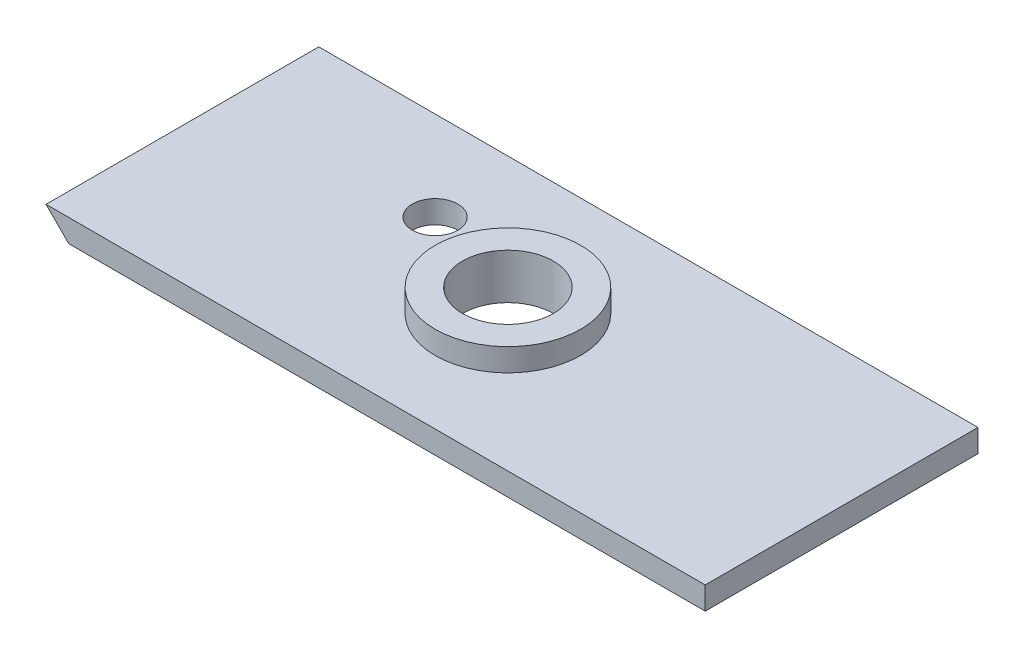
ISO-10303-21;
HEADER;
FILE_DESCRIPTION(('STEP AP214'),'2;1');
FILE_NAME('part.step','',(''),(''),'','','');
FILE_SCHEMA(('AUTOMOTIVE_DESIGN { 1 0 10303 214 1 1 1 1 }'));
ENDSEC;
DATA;
#1=APPLICATION_CONTEXT('core data for automotive mechanical design processes');
#2=APPLICATION_PROTOCOL_DEFINITION('international standard','automotive_design',2000,#1);
#3=PRODUCT_CONTEXT('',#1,'mechanical');
#4=PRODUCT('Part','Part','',(#3));
#5=PRODUCT_RELATED_PRODUCT_CATEGORY('part','',(#4));
#6=PRODUCT_DEFINITION_FORMATION('','',#4);
#7=PRODUCT_DEFINITION_CONTEXT('part definition',#1,'design');
#8=PRODUCT_DEFINITION('design','',#6,#7);
#9=PRODUCT_DEFINITION_SHAPE('','',#8);
#10=(LENGTH_UNIT() NAMED_UNIT(*) SI_UNIT(.MILLI.,.METRE.));
#11=(NAMED_UNIT(*) PLANE_ANGLE_UNIT() SI_UNIT($,.RADIAN.));
#12=(NAMED_UNIT(*) SI_UNIT($,.STERADIAN.) SOLID_ANGLE_UNIT());
#13=UNCERTAINTY_MEASURE_WITH_UNIT(LENGTH_MEASURE(1.E-05),#10,'distance_accuracy_value','');
#14=(GEOMETRIC_REPRESENTATION_CONTEXT(3) GLOBAL_UNCERTAINTY_ASSIGNED_CONTEXT((#13)) GLOBAL_UNIT_ASSIGNED_CONTEXT((#10,
#11,#12)) REPRESENTATION_CONTEXT('',''));
#15=CARTESIAN_POINT('',(0.,0.,0.));
#16=DIRECTION('',(0.,0.,1.));
#17=DIRECTION('',(1.,0.,0.));
#18=AXIS2_PLACEMENT_3D('',#15,#16,#17);
#19=CARTESIAN_POINT('',(0.,1.,0.));
#20=DIRECTION('',(0.,1.,0.));
#21=DIRECTION('',(0.,0.,1.));
#22=AXIS2_PLACEMENT_3D('',#19,#20,#21);
#23=PLANE('',#22);
#24=DIRECTION('',(0.,0.,-1.));
#25=VECTOR('',#24,1.);
#26=CARTESIAN_POINT('',(9.47239378261489,1.,7.94741871015199));
#27=LINE('',#26,#25);
#28=CARTESIAN_POINT('',(9.47239378261489,1.,7.94741871015199));
#29=VERTEX_POINT('',#28);
#30=CARTESIAN_POINT('',(9.47239378261489,1.,-4.05258128984801));
#31=VERTEX_POINT('',#30);
#32=EDGE_CURVE('E81',#29,#31,#27,.T.);
#33=ORIENTED_EDGE('',*,*,#32,.T.);
#34=DIRECTION('',(-1.,0.,0.));
#35=VECTOR('',#34,1.);
#36=CARTESIAN_POINT('',(-18.5276062173851,1.,-4.05258128984801));
#37=LINE('',#36,#35);
#38=CARTESIAN_POINT('',(-19.5276062173851,1.,-4.05258128984801));
#39=VERTEX_POINT('',#38);
#40=EDGE_CURVE('E11',#31,#39,#37,.T.);
#41=ORIENTED_EDGE('',*,*,#40,.T.);
#42=DIRECTION('',(0.,0.,-1.));
#43=VECTOR('',#42,1.);
#44=CARTESIAN_POINT('',(-19.5276062173851,1.,7.94741871015199));
#45=LINE('',#44,#43);
#46=CARTESIAN_POINT('',(-19.5276062173851,1.,7.94741871015199));
#47=VERTEX_POINT('',#46);
#48=EDGE_CURVE('E98',#47,#39,#45,.T.);
#49=ORIENTED_EDGE('',*,*,#48,.F.);
#50=DIRECTION('',(1.,0.,0.));
#51=VECTOR('',#50,1.);
#52=CARTESIAN_POINT('',(-18.5276062173851,1.,7.94741871015199));
#53=LINE('',#52,#51);
#54=EDGE_CURVE('E49',#47,#29,#53,.T.);
#55=ORIENTED_EDGE('',*,*,#54,.T.);
#56=EDGE_LOOP('',(#33,#41,#49,#55));
#57=FACE_BOUND('',#56,.T.);
#58=CARTESIAN_POINT('',(-10.4812096573851,1.,-0.122716729848009));
#59=DIRECTION('',(0.,1.,0.));
#60=DIRECTION('',(0.,0.,1.));
#61=AXIS2_PLACEMENT_3D('',#58,#59,#60);
#62=CIRCLE('',#61,1.);
#63=CARTESIAN_POINT('',(-10.4812096573851,1.,0.877283270151991));
#64=VERTEX_POINT('',#63);
#65=EDGE_CURVE('E123',#64,#64,#62,.T.);
#66=ORIENTED_EDGE('',*,*,#65,.F.);
#67=EDGE_LOOP('',(#66));
#68=FACE_BOUND('',#67,.T.);
#69=CARTESIAN_POINT('',(-5.2076062173851,1.,1.94741871015199));
#70=DIRECTION('',(0.,1.,0.));
#71=DIRECTION('',(0.,0.,1.));
#72=AXIS2_PLACEMENT_3D('',#69,#70,#71);
#73=CIRCLE('',#72,3.2);
#74=CARTESIAN_POINT('',(-5.2076062173851,1.,5.14741871015199));
#75=VERTEX_POINT('',#74);
#76=EDGE_CURVE('E116',#75,#75,#73,.T.);
#77=ORIENTED_EDGE('',*,*,#76,.F.);
#78=EDGE_LOOP('',(#77));
#79=FACE_BOUND('',#78,.T.);
#80=ADVANCED_FACE('F39',(#57,#68,#79),#23,.T.);
#81=CARTESIAN_POINT('',(0.,0.,0.));
#82=DIRECTION('',(0.,1.,0.));
#83=DIRECTION('',(0.,0.,1.));
#84=AXIS2_PLACEMENT_3D('',#81,#82,#83);
#85=PLANE('',#84);
#86=CARTESIAN_POINT('',(-10.4812096573851,0.,-0.122716729848009));
#87=DIRECTION('',(0.,-1.,0.));
#88=DIRECTION('',(0.,0.,-1.));
#89=AXIS2_PLACEMENT_3D('',#86,#87,#88);
#90=CIRCLE('',#89,1.);
#91=CARTESIAN_POINT('',(-10.4812096573851,0.,-1.12271672984801));
#92=VERTEX_POINT('',#91);
#93=EDGE_CURVE('E127',#92,#92,#90,.T.);
#94=ORIENTED_EDGE('',*,*,#93,.F.);
#95=EDGE_LOOP('',(#94));
#96=FACE_BOUND('',#95,.T.);
#97=DIRECTION('',(-1.,0.,0.));
#98=VECTOR('',#97,1.);
#99=CARTESIAN_POINT('',(-18.5276062173851,0.,-4.05258128984801));
#100=LINE('',#99,#98);
#101=CARTESIAN_POINT('',(9.47239378261489,0.,-4.05258128984801));
#102=VERTEX_POINT('',#101);
#103=CARTESIAN_POINT('',(-18.5276062173851,0.,-4.05258128984801));
#104=VERTEX_POINT('',#103);
#105=EDGE_CURVE('E43',#102,#104,#100,.T.);
#106=ORIENTED_EDGE('',*,*,#105,.F.);
#107=DIRECTION('',(0.,0.,-1.));
#108=VECTOR('',#107,1.);
#109=CARTESIAN_POINT('',(9.47239378261489,0.,7.94741871015199));
#110=LINE('',#109,#108);
#111=CARTESIAN_POINT('',(9.47239378261489,0.,7.94741871015199));
#112=VERTEX_POINT('',#111);
#113=EDGE_CURVE('E57',#112,#102,#110,.T.);
#114=ORIENTED_EDGE('',*,*,#113,.F.);
#115=DIRECTION('',(1.,0.,0.));
#116=VECTOR('',#115,1.);
#117=CARTESIAN_POINT('',(-18.5276062173851,0.,7.94741871015199));
#118=LINE('',#117,#116);
#119=CARTESIAN_POINT('',(-18.5276062173851,0.,7.94741871015199));
#120=VERTEX_POINT('',#119);
#121=EDGE_CURVE('E64',#120,#112,#118,.T.);
#122=ORIENTED_EDGE('',*,*,#121,.F.);
#123=DIRECTION('',(0.,0.,1.));
#124=VECTOR('',#123,1.);
#125=CARTESIAN_POINT('',(-18.5276062173851,0.,-4.05258128984801));
#126=LINE('',#125,#124);
#127=EDGE_CURVE('E107',#104,#120,#126,.T.);
#128=ORIENTED_EDGE('',*,*,#127,.F.);
#129=EDGE_LOOP('',(#106,#114,#122,#128));
#130=FACE_BOUND('',#129,.T.);
#131=CARTESIAN_POINT('',(-5.2076062173851,0.,1.94741871015199));
#132=DIRECTION('',(0.,1.,0.));
#133=DIRECTION('',(0.,0.,1.));
#134=AXIS2_PLACEMENT_3D('',#131,#132,#133);
#135=CIRCLE('',#134,2.);
#136=CARTESIAN_POINT('',(-5.2076062173851,0.,3.94741871015199));
#137=VERTEX_POINT('',#136);
#138=EDGE_CURVE('E104',#137,#137,#135,.T.);
#139=ORIENTED_EDGE('',*,*,#138,.T.);
#140=EDGE_LOOP('',(#139));
#141=FACE_BOUND('',#140,.T.);
#142=ADVANCED_FACE('F147',(#96,#130,#141),#85,.F.);
#143=CARTESIAN_POINT('',(-18.5276062173851,1.,7.94741871015199));
#144=DIRECTION('',(0.,0.,-1.));
#145=DIRECTION('',(-1.,0.,0.));
#146=AXIS2_PLACEMENT_3D('',#143,#144,#145);
#147=PLANE('',#146);
#148=ORIENTED_EDGE('',*,*,#121,.T.);
#149=DIRECTION('',(0.,-1.,0.));
#150=VECTOR('',#149,1.);
#151=CARTESIAN_POINT('',(9.47239378261489,1.,7.94741871015199));
#152=LINE('',#151,#150);
#153=EDGE_CURVE('E84',#29,#112,#152,.T.);
#154=ORIENTED_EDGE('',*,*,#153,.F.);
#155=ORIENTED_EDGE('',*,*,#54,.F.);
#156=DIRECTION('',(-0.707106781186534,0.707106781186561,0.));
#157=VECTOR('',#156,1.);
#158=CARTESIAN_POINT('',(-18.5276062173851,0.,7.94741871015199));
#159=LINE('',#158,#157);
#160=EDGE_CURVE('E133',#120,#47,#159,.T.);
#161=ORIENTED_EDGE('',*,*,#160,.F.);
#162=EDGE_LOOP('',(#148,#154,#155,#161));
#163=FACE_BOUND('',#162,.T.);
#164=ADVANCED_FACE('F41',(#163),#147,.F.);
#165=CARTESIAN_POINT('',(-18.5276062173851,1.,-4.05258128984801));
#166=DIRECTION('',(0.,0.,1.));
#167=DIRECTION('',(1.,0.,0.));
#168=AXIS2_PLACEMENT_3D('',#165,#166,#167);
#169=PLANE('',#168);
#170=ORIENTED_EDGE('',*,*,#40,.F.);
#171=DIRECTION('',(0.,-1.,0.));
#172=VECTOR('',#171,1.);
#173=CARTESIAN_POINT('',(9.47239378261489,1.,-4.05258128984801));
#174=LINE('',#173,#172);
#175=EDGE_CURVE('E85',#31,#102,#174,.T.);
#176=ORIENTED_EDGE('',*,*,#175,.T.);
#177=ORIENTED_EDGE('',*,*,#105,.T.);
#178=DIRECTION('',(-0.707106781186534,0.707106781186561,0.));
#179=VECTOR('',#178,1.);
#180=CARTESIAN_POINT('',(-18.5276062173851,0.,-4.05258128984801));
#181=LINE('',#180,#179);
#182=EDGE_CURVE('E136',#104,#39,#181,.T.);
#183=ORIENTED_EDGE('',*,*,#182,.T.);
#184=EDGE_LOOP('',(#170,#176,#177,#183));
#185=FACE_BOUND('',#184,.T.);
#186=ADVANCED_FACE('F146',(#185),#169,.F.);
#187=CARTESIAN_POINT('',(-5.2076062173851,1.,1.94741871015199));
#188=DIRECTION('',(0.,-1.,0.));
#189=DIRECTION('',(0.,0.,-1.));
#190=AXIS2_PLACEMENT_3D('',#187,#188,#189);
#191=CYLINDRICAL_SURFACE('',#190,2.);
#192=ORIENTED_EDGE('',*,*,#138,.F.);
#193=EDGE_LOOP('',(#192));
#194=FACE_BOUND('',#193,.T.);
#195=CARTESIAN_POINT('',(-5.2076062173851,2.,1.94741871015199));
#196=DIRECTION('',(0.,1.,0.));
#197=DIRECTION('',(0.,0.,1.));
#198=AXIS2_PLACEMENT_3D('',#195,#196,#197);
#199=CIRCLE('',#198,2.);
#200=CARTESIAN_POINT('',(-5.2076062173851,2.,3.94741871015199));
#201=VERTEX_POINT('',#200);
#202=EDGE_CURVE('E120',#201,#201,#199,.T.);
#203=ORIENTED_EDGE('',*,*,#202,.T.);
#204=EDGE_LOOP('',(#203));
#205=FACE_BOUND('',#204,.T.);
#206=ADVANCED_FACE('F171',(#194,#205),#191,.F.);
#207=CARTESIAN_POINT('',(-5.2076062173851,2.,1.94741871015199));
#208=DIRECTION('',(0.,1.,0.));
#209=DIRECTION('',(0.,0.,1.));
#210=AXIS2_PLACEMENT_3D('',#207,#208,#209);
#211=PLANE('',#210);
#212=CARTESIAN_POINT('',(-5.2076062173851,2.,1.94741871015199));
#213=DIRECTION('',(0.,1.,0.));
#214=DIRECTION('',(0.,0.,1.));
#215=AXIS2_PLACEMENT_3D('',#212,#213,#214);
#216=CIRCLE('',#215,3.2);
#217=CARTESIAN_POINT('',(-5.2076062173851,2.,5.14741871015199));
#218=VERTEX_POINT('',#217);
#219=EDGE_CURVE('E113',#218,#218,#216,.T.);
#220=ORIENTED_EDGE('',*,*,#219,.T.);
#221=EDGE_LOOP('',(#220));
#222=FACE_BOUND('',#221,.T.);
#223=ORIENTED_EDGE('',*,*,#202,.F.);
#224=EDGE_LOOP('',(#223));
#225=FACE_BOUND('',#224,.T.);
#226=ADVANCED_FACE('F178',(#222,#225),#211,.T.);
#227=CARTESIAN_POINT('',(-5.2076062173851,2.,1.94741871015199));
#228=DIRECTION('',(0.,-1.,0.));
#229=DIRECTION('',(0.,0.,-1.));
#230=AXIS2_PLACEMENT_3D('',#227,#228,#229);
#231=CYLINDRICAL_SURFACE('',#230,3.2);
#232=ORIENTED_EDGE('',*,*,#219,.F.);
#233=EDGE_LOOP('',(#232));
#234=FACE_BOUND('',#233,.T.);
#235=ORIENTED_EDGE('',*,*,#76,.T.);
#236=EDGE_LOOP('',(#235));
#237=FACE_BOUND('',#236,.T.);
#238=ADVANCED_FACE('F160',(#234,#237),#231,.T.);
#239=CARTESIAN_POINT('',(-10.4812096573851,5.,-0.122716729848009));
#240=DIRECTION('',(0.,-1.,0.));
#241=DIRECTION('',(0.,0.,-1.));
#242=AXIS2_PLACEMENT_3D('',#239,#240,#241);
#243=CYLINDRICAL_SURFACE('',#242,1.);
#244=ORIENTED_EDGE('',*,*,#65,.T.);
#245=EDGE_LOOP('',(#244));
#246=FACE_BOUND('',#245,.T.);
#247=ORIENTED_EDGE('',*,*,#93,.T.);
#248=EDGE_LOOP('',(#247));
#249=FACE_BOUND('',#248,.T.);
#250=ADVANCED_FACE('F153',(#246,#249),#243,.F.);
#251=CARTESIAN_POINT('',(-18.5276062173851,0.,7.94741871015199));
#252=DIRECTION('',(-0.707106781186561,-0.707106781186534,0.));
#253=DIRECTION('',(0.707106781186534,-0.707106781186561,0.));
#254=AXIS2_PLACEMENT_3D('',#251,#252,#253);
#255=PLANE('',#254);
#256=ORIENTED_EDGE('',*,*,#182,.F.);
#257=ORIENTED_EDGE('',*,*,#127,.T.);
#258=ORIENTED_EDGE('',*,*,#160,.T.);
#259=ORIENTED_EDGE('',*,*,#48,.T.);
#260=EDGE_LOOP('',(#256,#257,#258,#259));
#261=FACE_BOUND('',#260,.T.);
#262=ADVANCED_FACE('F151',(#261),#255,.T.);
#263=CARTESIAN_POINT('',(9.47239378261489,1.,7.94741871015199));
#264=DIRECTION('',(-1.,0.,0.));
#265=DIRECTION('',(0.,0.,1.));
#266=AXIS2_PLACEMENT_3D('',#263,#264,#265);
#267=PLANE('',#266);
#268=ORIENTED_EDGE('',*,*,#113,.T.);
#269=ORIENTED_EDGE('',*,*,#175,.F.);
#270=ORIENTED_EDGE('',*,*,#32,.F.);
#271=ORIENTED_EDGE('',*,*,#153,.T.);
#272=EDGE_LOOP('',(#268,#269,#270,#271));
#273=FACE_BOUND('',#272,.T.);
#274=ADVANCED_FACE('F83',(#273),#267,.F.);
#275=CLOSED_SHELL('',(#80,#142,#164,#186,#206,#226,#238,#250,#262,#274));
#276=MANIFOLD_SOLID_BREP('B2',#275);
#277=ADVANCED_BREP_SHAPE_REPRESENTATION('',(#18,#276),#14);
#278=SHAPE_DEFINITION_REPRESENTATION(#9,#277);
ENDSEC;
END-ISO-10303-21;
